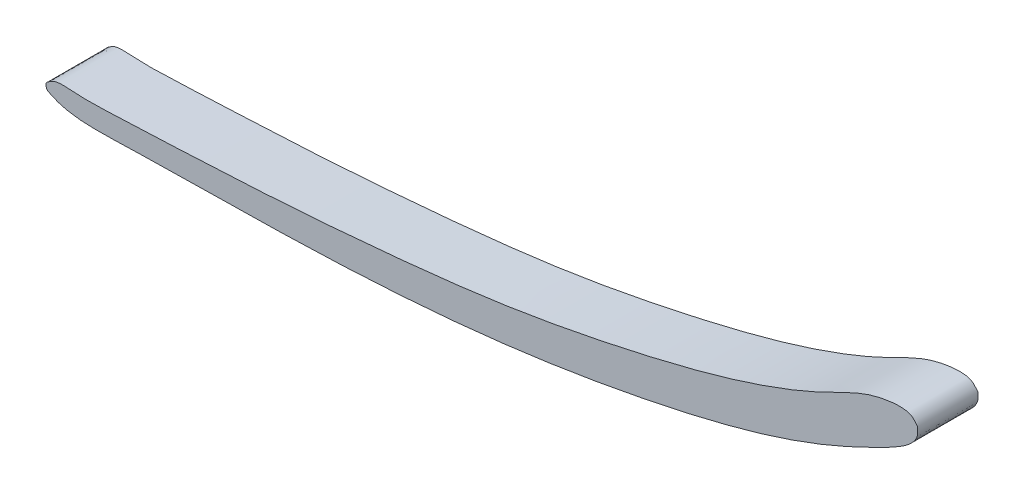
ISO-10303-21;
HEADER;
FILE_DESCRIPTION(('STEP AP214'),'2;1');
FILE_NAME('part.step','',(''),(''),'','','');
FILE_SCHEMA(('AUTOMOTIVE_DESIGN { 1 0 10303 214 1 1 1 1 }'));
ENDSEC;
DATA;
#1=APPLICATION_CONTEXT('core data for automotive mechanical design processes');
#2=APPLICATION_PROTOCOL_DEFINITION('international standard','automotive_design',2000,#1);
#3=PRODUCT_CONTEXT('',#1,'mechanical');
#4=PRODUCT('Part','Part','',(#3));
#5=PRODUCT_RELATED_PRODUCT_CATEGORY('part','',(#4));
#6=PRODUCT_DEFINITION_FORMATION('','',#4);
#7=PRODUCT_DEFINITION_CONTEXT('part definition',#1,'design');
#8=PRODUCT_DEFINITION('design','',#6,#7);
#9=PRODUCT_DEFINITION_SHAPE('','',#8);
#10=(LENGTH_UNIT() NAMED_UNIT(*) SI_UNIT(.MILLI.,.METRE.));
#11=(NAMED_UNIT(*) PLANE_ANGLE_UNIT() SI_UNIT($,.RADIAN.));
#12=(NAMED_UNIT(*) SI_UNIT($,.STERADIAN.) SOLID_ANGLE_UNIT());
#13=UNCERTAINTY_MEASURE_WITH_UNIT(LENGTH_MEASURE(1.E-05),#10,'distance_accuracy_value','');
#14=(GEOMETRIC_REPRESENTATION_CONTEXT(3) GLOBAL_UNCERTAINTY_ASSIGNED_CONTEXT((#13)) GLOBAL_UNIT_ASSIGNED_CONTEXT((#10,
#11,#12)) REPRESENTATION_CONTEXT('',''));
#15=CARTESIAN_POINT('',(0.,0.,0.));
#16=DIRECTION('',(0.,0.,1.));
#17=DIRECTION('',(1.,0.,0.));
#18=AXIS2_PLACEMENT_3D('',#15,#16,#17);
#19=CARTESIAN_POINT('',(59.8260710028093,0.,412.));
#20=CARTESIAN_POINT('',(59.8038378460253,0.0774097705061316,412.));
#21=CARTESIAN_POINT('',(59.7550099363139,0.141172131006284,412.));
#22=CARTESIAN_POINT('',(59.6523594743351,0.262366913584555,412.));
#23=CARTESIAN_POINT('',(59.5974510546407,0.319701405191331,412.));
#24=CARTESIAN_POINT('',(59.4362943504598,0.494954453957114,412.));
#25=CARTESIAN_POINT('',(59.3292692631891,0.613553055645172,412.));
#26=CARTESIAN_POINT('',(59.1514225025148,0.76936160752647,412.));
#27=CARTESIAN_POINT('',(59.0896988617667,0.817908584855809,412.));
#28=CARTESIAN_POINT('',(58.9575943984722,0.902984381117605,412.));
#29=CARTESIAN_POINT('',(58.8871606042536,0.939995453044351,412.));
#30=CARTESIAN_POINT('',(58.6671536322667,1.03537316634245,412.));
#31=CARTESIAN_POINT('',(58.5148252728434,1.07619029927319,412.));
#32=CARTESIAN_POINT('',(58.2047013467735,1.13582059841733,412.));
#33=CARTESIAN_POINT('',(58.0461649347051,1.15399622223419,412.));
#34=CARTESIAN_POINT('',(57.7311934079012,1.178063798074,412.));
#35=CARTESIAN_POINT('',(57.5740565741666,1.1836392507896,412.));
#36=CARTESIAN_POINT('',(57.1035655485317,1.18334704619277,412.));
#37=CARTESIAN_POINT('',(56.7910502267955,1.16195275064992,412.));
#38=CARTESIAN_POINT('',(55.8550984852619,1.06826239633281,412.));
#39=CARTESIAN_POINT('',(55.2311811268899,0.960508682983058,412.));
#40=CARTESIAN_POINT('',(54.0140026463146,0.679403181287258,412.));
#41=CARTESIAN_POINT('',(53.4181410627087,0.503241576053221,412.));
#42=CARTESIAN_POINT('',(51.6666215831442,-0.126145002207423,412.));
#43=CARTESIAN_POINT('',(50.5436909110864,-0.67120710094315,412.));
#44=CARTESIAN_POINT('',(48.8645643826013,-1.50265717567311,412.));
#45=CARTESIAN_POINT('',(48.3053241775663,-1.78096732255678,412.));
#46=CARTESIAN_POINT('',(47.1814848628482,-2.32432154362128,412.));
#47=CARTESIAN_POINT('',(46.6173263000357,-2.59045620015019,412.));
#48=CARTESIAN_POINT('',(44.912944393628,-3.35938609553962,412.));
#49=CARTESIAN_POINT('',(43.7613445677359,-3.83401863116764,412.));
#50=CARTESIAN_POINT('',(41.4376217682798,-4.7324782511248,412.));
#51=CARTESIAN_POINT('',(40.2656016617766,-5.15655998486422,412.));
#52=CARTESIAN_POINT('',(37.9067049510044,-5.96794590312055,412.));
#53=CARTESIAN_POINT('',(36.7185926055393,-6.35411551330589,412.));
#54=CARTESIAN_POINT('',(34.3301707176932,-7.08553718575386,412.));
#55=CARTESIAN_POINT('',(33.1303391537882,-7.43161090869723,412.));
#56=CARTESIAN_POINT('',(29.5182210354704,-8.42572881863704,412.));
#57=CARTESIAN_POINT('',(27.0939633912168,-9.03055924746959,412.));
#58=CARTESIAN_POINT('',(22.2313707049775,-10.1687513324166,412.));
#59=CARTESIAN_POINT('',(19.7915115677273,-10.7001943839789,412.));
#60=CARTESIAN_POINT('',(14.8974392876821,-11.6999619264938,412.));
#61=CARTESIAN_POINT('',(12.4438066646707,-12.1688513946052,412.));
#62=CARTESIAN_POINT('',(7.52164540276404,-13.0220344128956,412.));
#63=CARTESIAN_POINT('',(5.05359094258802,-13.4042637857956,412.));
#64=CARTESIAN_POINT('',(0.106254327017385,-14.0796657935719,412.));
#65=CARTESIAN_POINT('',(-2.37316667710176,-14.3749686658148,412.));
#66=CARTESIAN_POINT('',(-7.33922615658671,-14.9123806941192,412.));
#67=CARTESIAN_POINT('',(-9.82462465028741,-15.1560121676673,412.));
#68=CARTESIAN_POINT('',(-14.7982572189361,-15.6120934680806,412.));
#69=CARTESIAN_POINT('',(-17.2868125395335,-15.8223922943794,412.));
#70=CARTESIAN_POINT('',(-22.2670472001475,-16.2045974033357,412.));
#71=CARTESIAN_POINT('',(-24.7586003498597,-16.3730231203659,412.));
#72=CARTESIAN_POINT('',(-29.744013978023,-16.6734333985599,412.));
#73=CARTESIAN_POINT('',(-32.2379371149259,-16.805038651766,412.));
#74=CARTESIAN_POINT('',(-37.2268568915816,-17.0481794911086,412.));
#75=CARTESIAN_POINT('',(-39.7216221734327,-17.1634779299525,412.));
#76=CARTESIAN_POINT('',(-43.4639890963585,-17.3313925623506,412.));
#77=CARTESIAN_POINT('',(-44.7114889877856,-17.3864552858232,412.));
#78=CARTESIAN_POINT('',(-46.5830810247336,-17.4606242023611,412.));
#79=CARTESIAN_POINT('',(-47.2069558214159,-17.4853725757835,412.));
#80=CARTESIAN_POINT('',(-48.454747136591,-17.5324284373002,412.));
#81=CARTESIAN_POINT('',(-49.0786828516763,-17.5540777255743,412.));
#82=CARTESIAN_POINT('',(-50.3271406821181,-17.5698749222059,412.));
#83=CARTESIAN_POINT('',(-50.9520139691303,-17.561458218638,412.));
#84=CARTESIAN_POINT('',(-51.888240017508,-17.5176825543357,412.));
#85=CARTESIAN_POINT('',(-52.2001234441014,-17.4960346001038,412.));
#86=CARTESIAN_POINT('',(-52.8238767591053,-17.4522409587929,412.));
#87=CARTESIAN_POINT('',(-53.1358132638355,-17.4325444283355,412.));
#88=CARTESIAN_POINT('',(-53.60435826958,-17.4265384475329,412.));
#89=CARTESIAN_POINT('',(-53.7606361909178,-17.4280751975371,412.));
#90=CARTESIAN_POINT('',(-54.0735615616197,-17.4447344377356,412.));
#91=CARTESIAN_POINT('',(-54.2312070002675,-17.4601427977147,412.));
#92=CARTESIAN_POINT('',(-54.5413297628172,-17.5149520056614,412.));
#93=CARTESIAN_POINT('',(-54.6944459589573,-17.5544377670123,412.));
#94=CARTESIAN_POINT('',(-54.9886243070055,-17.6692143540852,412.));
#95=CARTESIAN_POINT('',(-55.1261510253354,-17.7432752935515,412.));
#96=CARTESIAN_POINT('',(-55.3919072923957,-17.9076072781135,412.));
#97=CARTESIAN_POINT('',(-55.519995409453,-17.9986227702368,412.));
#98=CARTESIAN_POINT('',(-55.7086467254127,-18.1396068602919,412.));
#99=CARTESIAN_POINT('',(-55.7693891317801,-18.1919251313353,412.));
#100=CARTESIAN_POINT('',(-55.8470836005475,-18.3281274283156,412.));
#101=CARTESIAN_POINT('',(-55.865513154773,-18.4075414975375,412.));
#102=CARTESIAN_POINT('',(-55.8663750523365,-18.5629662128565,412.));
#103=CARTESIAN_POINT('',(-55.853961810921,-18.6402353892739,412.));
#104=CARTESIAN_POINT('',(-55.8280746328762,-18.793534333702,412.));
#105=CARTESIAN_POINT('',(-55.8113825179286,-18.8691290360425,412.));
#106=CARTESIAN_POINT('',(-55.7627466037291,-18.9758810962312,412.));
#107=CARTESIAN_POINT('',(-55.742446108373,-19.0101183484042,412.));
#108=CARTESIAN_POINT('',(-55.6920346228757,-19.0699018766393,412.));
#109=CARTESIAN_POINT('',(-55.6609631953935,-19.0952861777416,412.));
#110=CARTESIAN_POINT('',(-55.5623941719324,-19.1586465069932,412.));
#111=CARTESIAN_POINT('',(-55.488028205142,-19.1869522235232,412.));
#112=CARTESIAN_POINT('',(-55.268234721572,-19.2737360986206,412.));
#113=CARTESIAN_POINT('',(-55.1241546566482,-19.3372345876477,412.));
#114=CARTESIAN_POINT('',(-54.8382137270829,-19.4693448307134,412.));
#115=CARTESIAN_POINT('',(-54.6957997390898,-19.5370641967146,412.));
#116=CARTESIAN_POINT('',(-54.2627032203241,-19.7202198233675,412.));
#117=CARTESIAN_POINT('',(-53.9660546628463,-19.8147816875463,412.));
#118=CARTESIAN_POINT('',(-53.3639157037355,-19.9731482717491,412.));
#119=CARTESIAN_POINT('',(-53.0587868652265,-20.0382107213748,412.));
#120=CARTESIAN_POINT('',(-52.4433674113287,-20.1503799189868,412.));
#121=CARTESIAN_POINT('',(-52.1329120965577,-20.1962940545792,412.));
#122=CARTESIAN_POINT('',(-51.2025887904961,-20.3053845395391,412.));
#123=CARTESIAN_POINT('',(-50.5805813994797,-20.3400311011772,412.));
#124=CARTESIAN_POINT('',(-49.3348372949755,-20.3725727069708,412.));
#125=CARTESIAN_POINT('',(-48.7111613991254,-20.3717602460275,412.));
#126=CARTESIAN_POINT('',(-46.8390575588315,-20.3464524922774,412.));
#127=CARTESIAN_POINT('',(-45.5911243558198,-20.304024090908,412.));
#128=CARTESIAN_POINT('',(-43.0954404767353,-20.2308424355553,412.));
#129=CARTESIAN_POINT('',(-41.8475138370879,-20.1980484322702,412.));
#130=CARTESIAN_POINT('',(-38.1032963142465,-20.1192827517678,412.));
#131=CARTESIAN_POINT('',(-35.606676423692,-20.0880505934724,412.));
#132=CARTESIAN_POINT('',(-30.6136293839772,-20.0169257604038,412.));
#133=CARTESIAN_POINT('',(-28.1171755637998,-19.9782894958871,412.));
#134=CARTESIAN_POINT('',(-23.1251302677258,-19.8629864446652,412.));
#135=CARTESIAN_POINT('',(-20.6295145099083,-19.7873905227502,412.));
#136=CARTESIAN_POINT('',(-15.6394443729049,-19.5849803467497,412.));
#137=CARTESIAN_POINT('',(-13.1461228364931,-19.4583892721265,412.));
#138=CARTESIAN_POINT('',(-5.67222964367235,-18.9917156580891,412.));
#139=CARTESIAN_POINT('',(-0.695401189804781,-18.5612511893951,412.));
#140=CARTESIAN_POINT('',(9.22356477000406,-17.3908713421352,412.));
#141=CARTESIAN_POINT('',(14.1649360943812,-16.6488339057743,412.));
#142=CARTESIAN_POINT('',(21.537471016869,-15.3201905658159,412.));
#143=CARTESIAN_POINT('',(23.986921144006,-14.840643494969,412.));
#144=CARTESIAN_POINT('',(28.8688226281279,-13.8042343218543,412.));
#145=CARTESIAN_POINT('',(31.3010028703569,-13.2461391159163,412.));
#146=CARTESIAN_POINT('',(36.1400885684282,-12.0149920991705,412.));
#147=CARTESIAN_POINT('',(38.5476245382984,-11.3414099816418,412.));
#148=CARTESIAN_POINT('',(43.3034397405114,-9.81892093117523,412.));
#149=CARTESIAN_POINT('',(45.6552129323872,-8.9681675497823,412.));
#150=CARTESIAN_POINT('',(50.274468082705,-7.06581828591812,412.));
#151=CARTESIAN_POINT('',(52.5431075044146,-6.01251666229732,412.));
#152=CARTESIAN_POINT('',(55.3300736955202,-4.60225225309574,412.));
#153=CARTESIAN_POINT('',(55.8852487044624,-4.3153619031199,412.));
#154=CARTESIAN_POINT('',(56.7077706094411,-3.86667232093338,412.));
#155=CARTESIAN_POINT('',(56.979894823057,-3.7134858491365,412.));
#156=CARTESIAN_POINT('',(57.5169564060726,-3.39440897931298,412.));
#157=CARTESIAN_POINT('',(57.7825441462282,-3.22901821297161,412.));
#158=CARTESIAN_POINT('',(58.2953727408293,-2.87609919729157,412.));
#159=CARTESIAN_POINT('',(58.5429292708678,-2.68836043268911,412.));
#160=CARTESIAN_POINT('',(59.0075642009972,-2.27407282379366,412.));
#161=CARTESIAN_POINT('',(59.2255313097646,-2.04374266005147,412.));
#162=CARTESIAN_POINT('',(59.5022824356059,-1.66462998210651,412.));
#163=CARTESIAN_POINT('',(59.5871403814955,-1.53216207509893,412.));
#164=CARTESIAN_POINT('',(59.7282659268919,-1.25006774855224,412.));
#165=CARTESIAN_POINT('',(59.7834475742853,-1.10420823612326,412.));
#166=CARTESIAN_POINT('',(59.8387987316217,-0.795277361808816,412.));
#167=CARTESIAN_POINT('',(59.8353544297409,-0.6341184648819,412.));
#168=CARTESIAN_POINT('',(59.8326043386865,-0.396323531174192,412.));
#169=CARTESIAN_POINT('',(59.8350392311102,-0.317056218429673,412.));
#170=CARTESIAN_POINT('',(59.8417763724463,-0.158520292070641,412.));
#171=CARTESIAN_POINT('',(59.8483041595932,-0.0774097705061039,412.));
#172=CARTESIAN_POINT('',(59.8260710028093,0.,412.));
#173=B_SPLINE_CURVE_WITH_KNOTS('',3,(#19,#20,#21,#22,#23,#24,#25,#26,#27,#28,#29,#30,#31,#32,
#33,#34,#35,#36,#37,#38,#39,#40,#41,#42,#43,#44,#45,#46,#47,#48,#49,#50,#51,#52,#53,#54,#55,#56,
#57,#58,#59,#60,#61,#62,#63,#64,#65,#66,#67,#68,#69,#70,#71,#72,#73,#74,#75,#76,#77,#78,#79,#80,
#81,#82,#83,#84,#85,#86,#87,#88,#89,#90,#91,#92,#93,#94,#95,#96,#97,#98,#99,#100,#101,#102,#103,
#104,#105,#106,#107,#108,#109,#110,#111,#112,#113,#114,#115,#116,#117,#118,#119,#120,#121,#122,
#123,#124,#125,#126,#127,#128,#129,#130,#131,#132,#133,#134,#135,#136,#137,#138,#139,#140,#141,
#142,#143,#144,#145,#146,#147,#148,#149,#150,#151,#152,#153,#154,#155,#156,#157,#158,#159,#160,
#161,#162,#163,#164,#165,#166,#167,#168,#169,#170,#171,#172),.UNSPECIFIED.,.T.,.F.,(4,2,2,2,2,2,
2,2,2,2,2,2,2,2,2,2,2,2,2,2,2,2,2,2,2,2,2,2,2,2,2,2,2,2,2,2,2,2,2,2,2,2,2,2,2,2,2,2,2,2,2,2,2,2,
2,2,2,2,2,2,2,2,2,2,2,2,2,2,2,2,2,2,2,2,2,2,4),(0.,0.00097656250000004,0.00195312500000008,
0.00390625000000022,0.00488281250000028,0.00585937500000035,0.00781250000000049,
0.00976562500000062,0.0117187500000008,0.0156250000000009,0.0234375000000013,0.0312500000000017,
0.0468750000000024,0.0546875000000028,0.0625000000000031,0.0781250000000038,0.0937500000000044,
0.109375000000005,0.125000000000006,0.156250000000007,0.187500000000008,0.21875000000001,
0.250000000000011,0.281250000000013,0.312500000000014,0.343750000000015,0.375000000000017,
0.406250000000018,0.437500000000019,0.45312500000002,0.46093750000002,0.468750000000021,
0.476562500000021,0.480468750000021,0.484375000000022,0.486328125000022,0.488281250000022,
0.490234375000022,0.492187500000022,0.494140625000022,0.495117187500022,0.496093750000022,
0.497070312500022,0.498046875000022,0.498535156250022,0.499023437500022,0.500000000000022,
0.501953125000022,0.503906250000022,0.507812500000022,0.511718750000022,0.515625000000022,
0.523437500000021,0.531250000000021,0.54687500000002,0.562500000000019,0.593750000000018,
0.625000000000017,0.656250000000015,0.687500000000014,0.750000000000011,0.812500000000008,
0.843750000000007,0.875000000000006,0.906250000000004,0.937500000000003,0.968750000000001,
0.976562500000001,0.980468750000001,0.984375000000001,0.988281250000001,0.9921875,0.994140625,
0.99609375,0.998046875,0.9990234375,1.),.UNSPECIFIED.);
#174=DIRECTION('',(0.,0.,-1.));
#175=VECTOR('',#174,1.);
#176=SURFACE_OF_LINEAR_EXTRUSION('',#173,#175);
#177=CARTESIAN_POINT('',(59.8260710028093,0.,412.));
#178=CARTESIAN_POINT('',(59.8483041595932,-0.0774097705061039,412.));
#179=CARTESIAN_POINT('',(59.8417763724463,-0.158520292070641,412.));
#180=CARTESIAN_POINT('',(59.8350392311102,-0.317056218429673,412.));
#181=CARTESIAN_POINT('',(59.8326043386865,-0.396323531174192,412.));
#182=CARTESIAN_POINT('',(59.8353544297409,-0.6341184648819,412.));
#183=CARTESIAN_POINT('',(59.8387987316217,-0.795277361808816,412.));
#184=CARTESIAN_POINT('',(59.7834475742853,-1.10420823612326,412.));
#185=CARTESIAN_POINT('',(59.7282659268919,-1.25006774855224,412.));
#186=CARTESIAN_POINT('',(59.5871403814955,-1.53216207509893,412.));
#187=CARTESIAN_POINT('',(59.5022824356059,-1.66462998210651,412.));
#188=CARTESIAN_POINT('',(59.2255313097646,-2.04374266005147,412.));
#189=CARTESIAN_POINT('',(59.0075642009972,-2.27407282379366,412.));
#190=CARTESIAN_POINT('',(58.5429292708678,-2.68836043268911,412.));
#191=CARTESIAN_POINT('',(58.2953727408293,-2.87609919729157,412.));
#192=CARTESIAN_POINT('',(57.7825441462282,-3.22901821297161,412.));
#193=CARTESIAN_POINT('',(57.5169564060726,-3.39440897931298,412.));
#194=CARTESIAN_POINT('',(56.979894823057,-3.7134858491365,412.));
#195=CARTESIAN_POINT('',(56.7077706094411,-3.86667232093338,412.));
#196=CARTESIAN_POINT('',(55.8852487044624,-4.3153619031199,412.));
#197=CARTESIAN_POINT('',(55.3300736955202,-4.60225225309574,412.));
#198=CARTESIAN_POINT('',(52.5431075044146,-6.01251666229732,412.));
#199=CARTESIAN_POINT('',(50.274468082705,-7.06581828591812,412.));
#200=CARTESIAN_POINT('',(45.6552129323872,-8.9681675497823,412.));
#201=CARTESIAN_POINT('',(43.3034397405114,-9.81892093117523,412.));
#202=CARTESIAN_POINT('',(38.5476245382984,-11.3414099816418,412.));
#203=CARTESIAN_POINT('',(36.1400885684282,-12.0149920991705,412.));
#204=CARTESIAN_POINT('',(31.3010028703569,-13.2461391159163,412.));
#205=CARTESIAN_POINT('',(28.8688226281279,-13.8042343218543,412.));
#206=CARTESIAN_POINT('',(23.986921144006,-14.840643494969,412.));
#207=CARTESIAN_POINT('',(21.537471016869,-15.3201905658159,412.));
#208=CARTESIAN_POINT('',(14.1649360943812,-16.6488339057743,412.));
#209=CARTESIAN_POINT('',(9.22356477000406,-17.3908713421352,412.));
#210=CARTESIAN_POINT('',(-0.695401189804781,-18.5612511893951,412.));
#211=CARTESIAN_POINT('',(-5.67222964367235,-18.9917156580891,412.));
#212=CARTESIAN_POINT('',(-13.1461228364931,-19.4583892721265,412.));
#213=CARTESIAN_POINT('',(-15.6394443729049,-19.5849803467497,412.));
#214=CARTESIAN_POINT('',(-20.6295145099083,-19.7873905227502,412.));
#215=CARTESIAN_POINT('',(-23.1251302677258,-19.8629864446652,412.));
#216=CARTESIAN_POINT('',(-28.1171755637998,-19.9782894958871,412.));
#217=CARTESIAN_POINT('',(-30.6136293839772,-20.0169257604038,412.));
#218=CARTESIAN_POINT('',(-35.606676423692,-20.0880505934724,412.));
#219=CARTESIAN_POINT('',(-38.1032963142465,-20.1192827517678,412.));
#220=CARTESIAN_POINT('',(-41.8475138370879,-20.1980484322702,412.));
#221=CARTESIAN_POINT('',(-43.0954404767353,-20.2308424355553,412.));
#222=CARTESIAN_POINT('',(-45.5911243558198,-20.304024090908,412.));
#223=CARTESIAN_POINT('',(-46.8390575588315,-20.3464524922774,412.));
#224=CARTESIAN_POINT('',(-48.7111613991254,-20.3717602460275,412.));
#225=CARTESIAN_POINT('',(-49.3348372949755,-20.3725727069708,412.));
#226=CARTESIAN_POINT('',(-50.5805813994797,-20.3400311011772,412.));
#227=CARTESIAN_POINT('',(-51.2025887904961,-20.3053845395391,412.));
#228=CARTESIAN_POINT('',(-52.1329120965577,-20.1962940545792,412.));
#229=CARTESIAN_POINT('',(-52.4433674113287,-20.1503799189868,412.));
#230=CARTESIAN_POINT('',(-53.0587868652265,-20.0382107213748,412.));
#231=CARTESIAN_POINT('',(-53.3639157037355,-19.9731482717491,412.));
#232=CARTESIAN_POINT('',(-53.9660546628463,-19.8147816875463,412.));
#233=CARTESIAN_POINT('',(-54.2627032203241,-19.7202198233675,412.));
#234=CARTESIAN_POINT('',(-54.6957997390898,-19.5370641967146,412.));
#235=CARTESIAN_POINT('',(-54.8382137270829,-19.4693448307134,412.));
#236=CARTESIAN_POINT('',(-55.1241546566482,-19.3372345876477,412.));
#237=CARTESIAN_POINT('',(-55.268234721572,-19.2737360986206,412.));
#238=CARTESIAN_POINT('',(-55.488028205142,-19.1869522235232,412.));
#239=CARTESIAN_POINT('',(-55.5623941719324,-19.1586465069932,412.));
#240=CARTESIAN_POINT('',(-55.6609631953935,-19.0952861777416,412.));
#241=CARTESIAN_POINT('',(-55.6920346228757,-19.0699018766393,412.));
#242=CARTESIAN_POINT('',(-55.742446108373,-19.0101183484042,412.));
#243=CARTESIAN_POINT('',(-55.7627466037291,-18.9758810962312,412.));
#244=CARTESIAN_POINT('',(-55.8113825179286,-18.8691290360425,412.));
#245=CARTESIAN_POINT('',(-55.8280746328762,-18.793534333702,412.));
#246=CARTESIAN_POINT('',(-55.853961810921,-18.6402353892739,412.));
#247=CARTESIAN_POINT('',(-55.8663750523365,-18.5629662128565,412.));
#248=CARTESIAN_POINT('',(-55.865513154773,-18.4075414975375,412.));
#249=CARTESIAN_POINT('',(-55.8470836005475,-18.3281274283156,412.));
#250=CARTESIAN_POINT('',(-55.7693891317801,-18.1919251313353,412.));
#251=CARTESIAN_POINT('',(-55.7086467254127,-18.1396068602919,412.));
#252=CARTESIAN_POINT('',(-55.519995409453,-17.9986227702368,412.));
#253=CARTESIAN_POINT('',(-55.3919072923957,-17.9076072781135,412.));
#254=CARTESIAN_POINT('',(-55.1261510253354,-17.7432752935515,412.));
#255=CARTESIAN_POINT('',(-54.9886243070055,-17.6692143540852,412.));
#256=CARTESIAN_POINT('',(-54.6944459589573,-17.5544377670123,412.));
#257=CARTESIAN_POINT('',(-54.5413297628172,-17.5149520056614,412.));
#258=CARTESIAN_POINT('',(-54.2312070002675,-17.4601427977147,412.));
#259=CARTESIAN_POINT('',(-54.0735615616197,-17.4447344377356,412.));
#260=CARTESIAN_POINT('',(-53.7606361909178,-17.4280751975371,412.));
#261=CARTESIAN_POINT('',(-53.60435826958,-17.4265384475329,412.));
#262=CARTESIAN_POINT('',(-53.1358132638355,-17.4325444283355,412.));
#263=CARTESIAN_POINT('',(-52.8238767591053,-17.4522409587929,412.));
#264=CARTESIAN_POINT('',(-52.2001234441014,-17.4960346001038,412.));
#265=CARTESIAN_POINT('',(-51.888240017508,-17.5176825543357,412.));
#266=CARTESIAN_POINT('',(-50.9520139691303,-17.561458218638,412.));
#267=CARTESIAN_POINT('',(-50.3271406821181,-17.5698749222059,412.));
#268=CARTESIAN_POINT('',(-49.0786828516763,-17.5540777255743,412.));
#269=CARTESIAN_POINT('',(-48.454747136591,-17.5324284373002,412.));
#270=CARTESIAN_POINT('',(-47.2069558214159,-17.4853725757835,412.));
#271=CARTESIAN_POINT('',(-46.5830810247336,-17.4606242023611,412.));
#272=CARTESIAN_POINT('',(-44.7114889877856,-17.3864552858232,412.));
#273=CARTESIAN_POINT('',(-43.4639890963585,-17.3313925623506,412.));
#274=CARTESIAN_POINT('',(-39.7216221734327,-17.1634779299525,412.));
#275=CARTESIAN_POINT('',(-37.2268568915816,-17.0481794911086,412.));
#276=CARTESIAN_POINT('',(-32.2379371149259,-16.805038651766,412.));
#277=CARTESIAN_POINT('',(-29.744013978023,-16.6734333985599,412.));
#278=CARTESIAN_POINT('',(-24.7586003498597,-16.3730231203659,412.));
#279=CARTESIAN_POINT('',(-22.2670472001475,-16.2045974033357,412.));
#280=CARTESIAN_POINT('',(-17.2868125395335,-15.8223922943794,412.));
#281=CARTESIAN_POINT('',(-14.7982572189361,-15.6120934680806,412.));
#282=CARTESIAN_POINT('',(-9.82462465028741,-15.1560121676673,412.));
#283=CARTESIAN_POINT('',(-7.33922615658671,-14.9123806941192,412.));
#284=CARTESIAN_POINT('',(-2.37316667710176,-14.3749686658148,412.));
#285=CARTESIAN_POINT('',(0.106254327017385,-14.0796657935719,412.));
#286=CARTESIAN_POINT('',(5.05359094258802,-13.4042637857956,412.));
#287=CARTESIAN_POINT('',(7.52164540276404,-13.0220344128956,412.));
#288=CARTESIAN_POINT('',(12.4438066646707,-12.1688513946052,412.));
#289=CARTESIAN_POINT('',(14.8974392876821,-11.6999619264938,412.));
#290=CARTESIAN_POINT('',(19.7915115677273,-10.7001943839789,412.));
#291=CARTESIAN_POINT('',(22.2313707049775,-10.1687513324166,412.));
#292=CARTESIAN_POINT('',(27.0939633912168,-9.03055924746959,412.));
#293=CARTESIAN_POINT('',(29.5182210354704,-8.42572881863704,412.));
#294=CARTESIAN_POINT('',(33.1303391537882,-7.43161090869723,412.));
#295=CARTESIAN_POINT('',(34.3301707176932,-7.08553718575386,412.));
#296=CARTESIAN_POINT('',(36.7185926055393,-6.35411551330589,412.));
#297=CARTESIAN_POINT('',(37.9067049510044,-5.96794590312055,412.));
#298=CARTESIAN_POINT('',(40.2656016617766,-5.15655998486422,412.));
#299=CARTESIAN_POINT('',(41.4376217682798,-4.7324782511248,412.));
#300=CARTESIAN_POINT('',(43.7613445677359,-3.83401863116764,412.));
#301=CARTESIAN_POINT('',(44.912944393628,-3.35938609553962,412.));
#302=CARTESIAN_POINT('',(46.6173263000357,-2.59045620015019,412.));
#303=CARTESIAN_POINT('',(47.1814848628482,-2.32432154362128,412.));
#304=CARTESIAN_POINT('',(48.3053241775663,-1.78096732255678,412.));
#305=CARTESIAN_POINT('',(48.8645643826013,-1.50265717567311,412.));
#306=CARTESIAN_POINT('',(50.5436909110864,-0.67120710094315,412.));
#307=CARTESIAN_POINT('',(51.6666215831442,-0.126145002207423,412.));
#308=CARTESIAN_POINT('',(53.4181410627087,0.503241576053221,412.));
#309=CARTESIAN_POINT('',(54.0140026463146,0.679403181287258,412.));
#310=CARTESIAN_POINT('',(55.2311811268899,0.960508682983058,412.));
#311=CARTESIAN_POINT('',(55.8550984852619,1.06826239633281,412.));
#312=CARTESIAN_POINT('',(56.7910502267955,1.16195275064992,412.));
#313=CARTESIAN_POINT('',(57.1035655485317,1.18334704619277,412.));
#314=CARTESIAN_POINT('',(57.5740565741666,1.1836392507896,412.));
#315=CARTESIAN_POINT('',(57.7311934079012,1.178063798074,412.));
#316=CARTESIAN_POINT('',(58.0461649347051,1.15399622223419,412.));
#317=CARTESIAN_POINT('',(58.2047013467735,1.13582059841733,412.));
#318=CARTESIAN_POINT('',(58.5148252728434,1.07619029927319,412.));
#319=CARTESIAN_POINT('',(58.6671536322667,1.03537316634245,412.));
#320=CARTESIAN_POINT('',(58.8871606042536,0.939995453044351,412.));
#321=CARTESIAN_POINT('',(58.9575943984722,0.902984381117605,412.));
#322=CARTESIAN_POINT('',(59.0896988617667,0.817908584855809,412.));
#323=CARTESIAN_POINT('',(59.1514225025148,0.76936160752647,412.));
#324=CARTESIAN_POINT('',(59.3292692631891,0.613553055645172,412.));
#325=CARTESIAN_POINT('',(59.4362943504598,0.494954453957114,412.));
#326=CARTESIAN_POINT('',(59.5974510546407,0.319701405191331,412.));
#327=CARTESIAN_POINT('',(59.6523594743351,0.262366913584555,412.));
#328=CARTESIAN_POINT('',(59.7550099363139,0.141172131006284,412.));
#329=CARTESIAN_POINT('',(59.8038378460253,0.0774097705061316,412.));
#330=CARTESIAN_POINT('',(59.8260710028093,0.,412.));
#331=B_SPLINE_CURVE_WITH_KNOTS('',3,(#177,#178,#179,#180,#181,#182,#183,#184,#185,#186,#187,
#188,#189,#190,#191,#192,#193,#194,#195,#196,#197,#198,#199,#200,#201,#202,#203,#204,#205,#206,
#207,#208,#209,#210,#211,#212,#213,#214,#215,#216,#217,#218,#219,#220,#221,#222,#223,#224,#225,
#226,#227,#228,#229,#230,#231,#232,#233,#234,#235,#236,#237,#238,#239,#240,#241,#242,#243,#244,
#245,#246,#247,#248,#249,#250,#251,#252,#253,#254,#255,#256,#257,#258,#259,#260,#261,#262,#263,
#264,#265,#266,#267,#268,#269,#270,#271,#272,#273,#274,#275,#276,#277,#278,#279,#280,#281,#282,
#283,#284,#285,#286,#287,#288,#289,#290,#291,#292,#293,#294,#295,#296,#297,#298,#299,#300,#301,
#302,#303,#304,#305,#306,#307,#308,#309,#310,#311,#312,#313,#314,#315,#316,#317,#318,#319,#320,
#321,#322,#323,#324,#325,#326,#327,#328,#329,#330),.UNSPECIFIED.,.T.,.F.,(4,2,2,2,2,2,2,2,2,2,2,
2,2,2,2,2,2,2,2,2,2,2,2,2,2,2,2,2,2,2,2,2,2,2,2,2,2,2,2,2,2,2,2,2,2,2,2,2,2,2,2,2,2,2,2,2,2,2,2,
2,2,2,2,2,2,2,2,2,2,2,2,2,2,2,2,2,4),(0.,0.000976562499999778,0.00195312499999978,
0.00390624999999967,0.00585937499999967,0.00781249999999967,0.0117187499999994,
0.0156249999999993,0.0195312499999991,0.023437499999999,0.0312499999999986,0.0624999999999972,
0.0937499999999958,0.124999999999994,0.156249999999993,0.187499999999992,0.249999999999989,
0.312499999999986,0.343749999999985,0.374999999999983,0.406249999999982,0.437499999999981,
0.45312499999998,0.468749999999979,0.476562499999979,0.484374999999978,0.488281249999978,
0.492187499999978,0.496093749999978,0.498046874999978,0.499999999999978,0.500976562499978,
0.501464843749978,0.501953124999978,0.502929687499978,0.503906249999978,0.504882812499978,
0.505859374999978,0.507812499999978,0.509765624999978,0.511718749999978,0.513671874999978,
0.515624999999978,0.519531249999979,0.523437499999979,0.531249999999979,0.53906249999998,
0.54687499999998,0.56249999999998,0.593749999999982,0.624999999999983,0.656249999999985,
0.687499999999986,0.718749999999987,0.749999999999989,0.78124999999999,0.812499999999992,
0.843749999999993,0.874999999999994,0.890624999999995,0.906249999999996,0.921874999999996,
0.937499999999997,0.945312499999997,0.953124999999998,0.968749999999998,0.976562499999999,
0.984374999999999,0.988281249999999,0.990234374999999,0.9921875,0.994140625,0.9951171875,
0.99609375,0.998046875,0.9990234375,1.),.UNSPECIFIED.);
#332=CARTESIAN_POINT('',(59.8260710028093,0.,412.));
#333=VERTEX_POINT('',#332);
#334=EDGE_CURVE('E10',#333,#333,#331,.F.);
#335=ORIENTED_EDGE('',*,*,#334,.F.);
#336=EDGE_LOOP('',(#335));
#337=FACE_BOUND('',#336,.T.);
#338=CARTESIAN_POINT('',(59.8260710028093,0.,404.000000000001));
#339=CARTESIAN_POINT('',(59.8038378460253,0.0774097705061316,404.000000000001));
#340=CARTESIAN_POINT('',(59.7550099363139,0.141172131006284,404.000000000001));
#341=CARTESIAN_POINT('',(59.6523594743351,0.262366913584555,404.000000000001));
#342=CARTESIAN_POINT('',(59.5974510546407,0.319701405191331,404.000000000001));
#343=CARTESIAN_POINT('',(59.4362943504598,0.494954453957114,404.000000000001));
#344=CARTESIAN_POINT('',(59.3292692631891,0.613553055645172,404.000000000001));
#345=CARTESIAN_POINT('',(59.1514225025148,0.76936160752647,404.000000000001));
#346=CARTESIAN_POINT('',(59.0896988617667,0.817908584855809,404.000000000001));
#347=CARTESIAN_POINT('',(58.9575943984722,0.902984381117605,404.000000000001));
#348=CARTESIAN_POINT('',(58.8871606042536,0.939995453044351,404.000000000001));
#349=CARTESIAN_POINT('',(58.6671536322667,1.03537316634245,404.000000000001));
#350=CARTESIAN_POINT('',(58.5148252728434,1.07619029927319,404.000000000001));
#351=CARTESIAN_POINT('',(58.2047013467735,1.13582059841733,404.000000000001));
#352=CARTESIAN_POINT('',(58.0461649347051,1.15399622223419,404.000000000001));
#353=CARTESIAN_POINT('',(57.7311934079012,1.178063798074,404.000000000001));
#354=CARTESIAN_POINT('',(57.5740565741666,1.1836392507896,404.000000000001));
#355=CARTESIAN_POINT('',(57.1035655485317,1.18334704619277,404.000000000001));
#356=CARTESIAN_POINT('',(56.7910502267955,1.16195275064992,404.000000000001));
#357=CARTESIAN_POINT('',(55.8550984852619,1.06826239633281,404.000000000001));
#358=CARTESIAN_POINT('',(55.2311811268899,0.960508682983058,404.000000000001));
#359=CARTESIAN_POINT('',(54.0140026463146,0.679403181287258,404.000000000001));
#360=CARTESIAN_POINT('',(53.4181410627087,0.503241576053221,404.000000000001));
#361=CARTESIAN_POINT('',(51.6666215831442,-0.126145002207423,404.000000000001));
#362=CARTESIAN_POINT('',(50.5436909110864,-0.67120710094315,404.000000000001));
#363=CARTESIAN_POINT('',(48.8645643826013,-1.50265717567311,404.000000000001));
#364=CARTESIAN_POINT('',(48.3053241775663,-1.78096732255678,404.000000000001));
#365=CARTESIAN_POINT('',(47.1814848628482,-2.32432154362128,404.000000000001));
#366=CARTESIAN_POINT('',(46.6173263000357,-2.59045620015019,404.000000000001));
#367=CARTESIAN_POINT('',(44.912944393628,-3.35938609553962,404.000000000001));
#368=CARTESIAN_POINT('',(43.7613445677359,-3.83401863116764,404.000000000001));
#369=CARTESIAN_POINT('',(41.4376217682798,-4.7324782511248,404.000000000001));
#370=CARTESIAN_POINT('',(40.2656016617766,-5.15655998486422,404.000000000001));
#371=CARTESIAN_POINT('',(37.9067049510044,-5.96794590312055,404.000000000001));
#372=CARTESIAN_POINT('',(36.7185926055393,-6.35411551330589,404.000000000001));
#373=CARTESIAN_POINT('',(34.3301707176932,-7.08553718575386,404.000000000001));
#374=CARTESIAN_POINT('',(33.1303391537882,-7.43161090869723,404.000000000001));
#375=CARTESIAN_POINT('',(29.5182210354704,-8.42572881863704,404.000000000001));
#376=CARTESIAN_POINT('',(27.0939633912168,-9.03055924746959,404.000000000001));
#377=CARTESIAN_POINT('',(22.2313707049775,-10.1687513324166,404.000000000001));
#378=CARTESIAN_POINT('',(19.7915115677273,-10.7001943839789,404.000000000001));
#379=CARTESIAN_POINT('',(14.8974392876821,-11.6999619264938,404.000000000001));
#380=CARTESIAN_POINT('',(12.4438066646707,-12.1688513946052,404.000000000001));
#381=CARTESIAN_POINT('',(7.52164540276404,-13.0220344128956,404.000000000001));
#382=CARTESIAN_POINT('',(5.05359094258802,-13.4042637857956,404.000000000001));
#383=CARTESIAN_POINT('',(0.106254327017385,-14.0796657935719,404.000000000001));
#384=CARTESIAN_POINT('',(-2.37316667710176,-14.3749686658148,404.000000000001));
#385=CARTESIAN_POINT('',(-7.33922615658671,-14.9123806941192,404.000000000001));
#386=CARTESIAN_POINT('',(-9.82462465028741,-15.1560121676673,404.000000000001));
#387=CARTESIAN_POINT('',(-14.7982572189361,-15.6120934680806,404.000000000001));
#388=CARTESIAN_POINT('',(-17.2868125395335,-15.8223922943794,404.000000000001));
#389=CARTESIAN_POINT('',(-22.2670472001475,-16.2045974033357,404.000000000001));
#390=CARTESIAN_POINT('',(-24.7586003498597,-16.3730231203659,404.000000000001));
#391=CARTESIAN_POINT('',(-29.744013978023,-16.6734333985599,404.000000000001));
#392=CARTESIAN_POINT('',(-32.2379371149259,-16.805038651766,404.000000000001));
#393=CARTESIAN_POINT('',(-37.2268568915816,-17.0481794911086,404.000000000001));
#394=CARTESIAN_POINT('',(-39.7216221734327,-17.1634779299525,404.000000000001));
#395=CARTESIAN_POINT('',(-43.4639890963585,-17.3313925623506,404.000000000001));
#396=CARTESIAN_POINT('',(-44.7114889877856,-17.3864552858232,404.000000000001));
#397=CARTESIAN_POINT('',(-46.5830810247336,-17.4606242023611,404.000000000001));
#398=CARTESIAN_POINT('',(-47.2069558214159,-17.4853725757835,404.000000000001));
#399=CARTESIAN_POINT('',(-48.454747136591,-17.5324284373002,404.000000000001));
#400=CARTESIAN_POINT('',(-49.0786828516763,-17.5540777255743,404.000000000001));
#401=CARTESIAN_POINT('',(-50.3271406821181,-17.5698749222059,404.000000000001));
#402=CARTESIAN_POINT('',(-50.9520139691303,-17.561458218638,404.000000000001));
#403=CARTESIAN_POINT('',(-51.888240017508,-17.5176825543357,404.000000000001));
#404=CARTESIAN_POINT('',(-52.2001234441014,-17.4960346001038,404.000000000001));
#405=CARTESIAN_POINT('',(-52.8238767591053,-17.4522409587929,404.000000000001));
#406=CARTESIAN_POINT('',(-53.1358132638355,-17.4325444283355,404.000000000001));
#407=CARTESIAN_POINT('',(-53.60435826958,-17.4265384475329,404.000000000001));
#408=CARTESIAN_POINT('',(-53.7606361909178,-17.4280751975371,404.000000000001));
#409=CARTESIAN_POINT('',(-54.0735615616197,-17.4447344377356,404.000000000001));
#410=CARTESIAN_POINT('',(-54.2312070002675,-17.4601427977147,404.000000000001));
#411=CARTESIAN_POINT('',(-54.5413297628172,-17.5149520056614,404.000000000001));
#412=CARTESIAN_POINT('',(-54.6944459589573,-17.5544377670123,404.000000000001));
#413=CARTESIAN_POINT('',(-54.9886243070055,-17.6692143540852,404.000000000001));
#414=CARTESIAN_POINT('',(-55.1261510253354,-17.7432752935515,404.000000000001));
#415=CARTESIAN_POINT('',(-55.3919072923957,-17.9076072781135,404.000000000001));
#416=CARTESIAN_POINT('',(-55.519995409453,-17.9986227702368,404.000000000001));
#417=CARTESIAN_POINT('',(-55.7086467254127,-18.1396068602919,404.000000000001));
#418=CARTESIAN_POINT('',(-55.7693891317801,-18.1919251313353,404.000000000001));
#419=CARTESIAN_POINT('',(-55.8470836005475,-18.3281274283156,404.000000000001));
#420=CARTESIAN_POINT('',(-55.865513154773,-18.4075414975375,404.000000000001));
#421=CARTESIAN_POINT('',(-55.8663750523365,-18.5629662128565,404.000000000001));
#422=CARTESIAN_POINT('',(-55.853961810921,-18.6402353892739,404.000000000001));
#423=CARTESIAN_POINT('',(-55.8280746328762,-18.793534333702,404.000000000001));
#424=CARTESIAN_POINT('',(-55.8113825179286,-18.8691290360425,404.000000000001));
#425=CARTESIAN_POINT('',(-55.7627466037291,-18.9758810962312,404.000000000001));
#426=CARTESIAN_POINT('',(-55.742446108373,-19.0101183484042,404.000000000001));
#427=CARTESIAN_POINT('',(-55.6920346228757,-19.0699018766393,404.000000000001));
#428=CARTESIAN_POINT('',(-55.6609631953935,-19.0952861777416,404.000000000001));
#429=CARTESIAN_POINT('',(-55.5623941719324,-19.1586465069932,404.000000000001));
#430=CARTESIAN_POINT('',(-55.488028205142,-19.1869522235232,404.000000000001));
#431=CARTESIAN_POINT('',(-55.268234721572,-19.2737360986206,404.000000000001));
#432=CARTESIAN_POINT('',(-55.1241546566482,-19.3372345876477,404.000000000001));
#433=CARTESIAN_POINT('',(-54.8382137270829,-19.4693448307134,404.000000000001));
#434=CARTESIAN_POINT('',(-54.6957997390898,-19.5370641967146,404.000000000001));
#435=CARTESIAN_POINT('',(-54.2627032203241,-19.7202198233675,404.000000000001));
#436=CARTESIAN_POINT('',(-53.9660546628463,-19.8147816875463,404.000000000001));
#437=CARTESIAN_POINT('',(-53.3639157037355,-19.9731482717491,404.000000000001));
#438=CARTESIAN_POINT('',(-53.0587868652265,-20.0382107213748,404.000000000001));
#439=CARTESIAN_POINT('',(-52.4433674113287,-20.1503799189868,404.000000000001));
#440=CARTESIAN_POINT('',(-52.1329120965577,-20.1962940545792,404.000000000001));
#441=CARTESIAN_POINT('',(-51.2025887904961,-20.3053845395391,404.000000000001));
#442=CARTESIAN_POINT('',(-50.5805813994797,-20.3400311011772,404.000000000001));
#443=CARTESIAN_POINT('',(-49.3348372949755,-20.3725727069708,404.000000000001));
#444=CARTESIAN_POINT('',(-48.7111613991254,-20.3717602460275,404.000000000001));
#445=CARTESIAN_POINT('',(-46.8390575588315,-20.3464524922774,404.000000000001));
#446=CARTESIAN_POINT('',(-45.5911243558198,-20.304024090908,404.000000000001));
#447=CARTESIAN_POINT('',(-43.0954404767353,-20.2308424355553,404.000000000001));
#448=CARTESIAN_POINT('',(-41.8475138370879,-20.1980484322702,404.000000000001));
#449=CARTESIAN_POINT('',(-38.1032963142465,-20.1192827517678,404.000000000001));
#450=CARTESIAN_POINT('',(-35.606676423692,-20.0880505934724,404.000000000001));
#451=CARTESIAN_POINT('',(-30.6136293839772,-20.0169257604038,404.000000000001));
#452=CARTESIAN_POINT('',(-28.1171755637998,-19.9782894958871,404.000000000001));
#453=CARTESIAN_POINT('',(-23.1251302677258,-19.8629864446652,404.000000000001));
#454=CARTESIAN_POINT('',(-20.6295145099083,-19.7873905227502,404.000000000001));
#455=CARTESIAN_POINT('',(-15.6394443729049,-19.5849803467497,404.000000000001));
#456=CARTESIAN_POINT('',(-13.1461228364931,-19.4583892721265,404.000000000001));
#457=CARTESIAN_POINT('',(-5.67222964367235,-18.9917156580891,404.000000000001));
#458=CARTESIAN_POINT('',(-0.695401189804781,-18.5612511893951,404.000000000001));
#459=CARTESIAN_POINT('',(9.22356477000406,-17.3908713421352,404.000000000001));
#460=CARTESIAN_POINT('',(14.1649360943812,-16.6488339057743,404.000000000001));
#461=CARTESIAN_POINT('',(21.537471016869,-15.3201905658159,404.000000000001));
#462=CARTESIAN_POINT('',(23.986921144006,-14.840643494969,404.000000000001));
#463=CARTESIAN_POINT('',(28.8688226281279,-13.8042343218543,404.000000000001));
#464=CARTESIAN_POINT('',(31.3010028703569,-13.2461391159163,404.000000000001));
#465=CARTESIAN_POINT('',(36.1400885684282,-12.0149920991705,404.000000000001));
#466=CARTESIAN_POINT('',(38.5476245382984,-11.3414099816418,404.000000000001));
#467=CARTESIAN_POINT('',(43.3034397405114,-9.81892093117523,404.000000000001));
#468=CARTESIAN_POINT('',(45.6552129323872,-8.9681675497823,404.000000000001));
#469=CARTESIAN_POINT('',(50.274468082705,-7.06581828591812,404.000000000001));
#470=CARTESIAN_POINT('',(52.5431075044146,-6.01251666229732,404.000000000001));
#471=CARTESIAN_POINT('',(55.3300736955202,-4.60225225309574,404.000000000001));
#472=CARTESIAN_POINT('',(55.8852487044624,-4.3153619031199,404.000000000001));
#473=CARTESIAN_POINT('',(56.7077706094411,-3.86667232093338,404.000000000001));
#474=CARTESIAN_POINT('',(56.979894823057,-3.7134858491365,404.000000000001));
#475=CARTESIAN_POINT('',(57.5169564060726,-3.39440897931298,404.000000000001));
#476=CARTESIAN_POINT('',(57.7825441462282,-3.22901821297161,404.000000000001));
#477=CARTESIAN_POINT('',(58.2953727408293,-2.87609919729157,404.000000000001));
#478=CARTESIAN_POINT('',(58.5429292708678,-2.68836043268911,404.000000000001));
#479=CARTESIAN_POINT('',(59.0075642009972,-2.27407282379366,404.000000000001));
#480=CARTESIAN_POINT('',(59.2255313097646,-2.04374266005147,404.000000000001));
#481=CARTESIAN_POINT('',(59.5022824356059,-1.66462998210651,404.000000000001));
#482=CARTESIAN_POINT('',(59.5871403814955,-1.53216207509893,404.000000000001));
#483=CARTESIAN_POINT('',(59.7282659268919,-1.25006774855224,404.000000000001));
#484=CARTESIAN_POINT('',(59.7834475742853,-1.10420823612326,404.000000000001));
#485=CARTESIAN_POINT('',(59.8387987316217,-0.795277361808816,404.000000000001));
#486=CARTESIAN_POINT('',(59.8353544297409,-0.6341184648819,404.000000000001));
#487=CARTESIAN_POINT('',(59.8326043386865,-0.396323531174192,404.000000000001));
#488=CARTESIAN_POINT('',(59.8350392311102,-0.317056218429673,404.000000000001));
#489=CARTESIAN_POINT('',(59.8417763724463,-0.158520292070641,404.000000000001));
#490=CARTESIAN_POINT('',(59.8483041595932,-0.0774097705061039,404.000000000001));
#491=CARTESIAN_POINT('',(59.8260710028093,0.,404.000000000001));
#492=B_SPLINE_CURVE_WITH_KNOTS('',3,(#338,#339,#340,#341,#342,#343,#344,#345,#346,#347,#348,
#349,#350,#351,#352,#353,#354,#355,#356,#357,#358,#359,#360,#361,#362,#363,#364,#365,#366,#367,
#368,#369,#370,#371,#372,#373,#374,#375,#376,#377,#378,#379,#380,#381,#382,#383,#384,#385,#386,
#387,#388,#389,#390,#391,#392,#393,#394,#395,#396,#397,#398,#399,#400,#401,#402,#403,#404,#405,
#406,#407,#408,#409,#410,#411,#412,#413,#414,#415,#416,#417,#418,#419,#420,#421,#422,#423,#424,
#425,#426,#427,#428,#429,#430,#431,#432,#433,#434,#435,#436,#437,#438,#439,#440,#441,#442,#443,
#444,#445,#446,#447,#448,#449,#450,#451,#452,#453,#454,#455,#456,#457,#458,#459,#460,#461,#462,
#463,#464,#465,#466,#467,#468,#469,#470,#471,#472,#473,#474,#475,#476,#477,#478,#479,#480,#481,
#482,#483,#484,#485,#486,#487,#488,#489,#490,#491),.UNSPECIFIED.,.T.,.F.,(4,2,2,2,2,2,2,2,2,2,2,
2,2,2,2,2,2,2,2,2,2,2,2,2,2,2,2,2,2,2,2,2,2,2,2,2,2,2,2,2,2,2,2,2,2,2,2,2,2,2,2,2,2,2,2,2,2,2,2,
2,2,2,2,2,2,2,2,2,2,2,2,2,2,2,2,2,4),(0.,0.00097656250000004,0.00195312500000008,
0.00390625000000022,0.00488281250000028,0.00585937500000035,0.00781250000000049,
0.00976562500000062,0.0117187500000008,0.0156250000000009,0.0234375000000013,0.0312500000000017,
0.0468750000000024,0.0546875000000028,0.0625000000000031,0.0781250000000038,0.0937500000000044,
0.109375000000005,0.125000000000006,0.156250000000007,0.187500000000008,0.21875000000001,
0.250000000000011,0.281250000000013,0.312500000000014,0.343750000000015,0.375000000000017,
0.406250000000018,0.437500000000019,0.45312500000002,0.46093750000002,0.468750000000021,
0.476562500000021,0.480468750000021,0.484375000000022,0.486328125000022,0.488281250000022,
0.490234375000022,0.492187500000022,0.494140625000022,0.495117187500022,0.496093750000022,
0.497070312500022,0.498046875000022,0.498535156250022,0.499023437500022,0.500000000000022,
0.501953125000022,0.503906250000022,0.507812500000022,0.511718750000022,0.515625000000022,
0.523437500000021,0.531250000000021,0.54687500000002,0.562500000000019,0.593750000000018,
0.625000000000017,0.656250000000015,0.687500000000014,0.750000000000011,0.812500000000008,
0.843750000000007,0.875000000000006,0.906250000000004,0.937500000000003,0.968750000000001,
0.976562500000001,0.980468750000001,0.984375000000001,0.988281250000001,0.9921875,0.994140625,
0.99609375,0.998046875,0.9990234375,1.),.UNSPECIFIED.);
#493=CARTESIAN_POINT('',(59.8260710028093,0.,404.000000000001));
#494=VERTEX_POINT('',#493);
#495=EDGE_CURVE('E38',#494,#494,#492,.T.);
#496=ORIENTED_EDGE('',*,*,#495,.T.);
#497=EDGE_LOOP('',(#496));
#498=FACE_BOUND('',#497,.T.);
#499=ADVANCED_FACE('F28',(#337,#498),#176,.F.);
#500=CARTESIAN_POINT('',(-55.4147637106236,-19.215880181887,412.));
#501=DIRECTION('',(0.,0.,-1.));
#502=DIRECTION('',(-1.,0.,0.));
#503=AXIS2_PLACEMENT_3D('',#500,#501,#502);
#504=PLANE('',#503);
#505=ORIENTED_EDGE('',*,*,#334,.T.);
#506=EDGE_LOOP('',(#505));
#507=FACE_BOUND('',#506,.T.);
#508=ADVANCED_FACE('F69',(#507),#504,.F.);
#509=CARTESIAN_POINT('',(-55.4147637106236,-19.215880181887,404.));
#510=DIRECTION('',(0.,0.,-1.));
#511=DIRECTION('',(-1.,0.,0.));
#512=AXIS2_PLACEMENT_3D('',#509,#510,#511);
#513=PLANE('',#512);
#514=ORIENTED_EDGE('',*,*,#495,.F.);
#515=EDGE_LOOP('',(#514));
#516=FACE_BOUND('',#515,.T.);
#517=ADVANCED_FACE('F77',(#516),#513,.T.);
#518=CLOSED_SHELL('',(#499,#508,#517));
#519=MANIFOLD_SOLID_BREP('B2',#518);
#520=ADVANCED_BREP_SHAPE_REPRESENTATION('',(#18,#519),#14);
#521=SHAPE_DEFINITION_REPRESENTATION(#9,#520);
ENDSEC;
END-ISO-10303-21;
